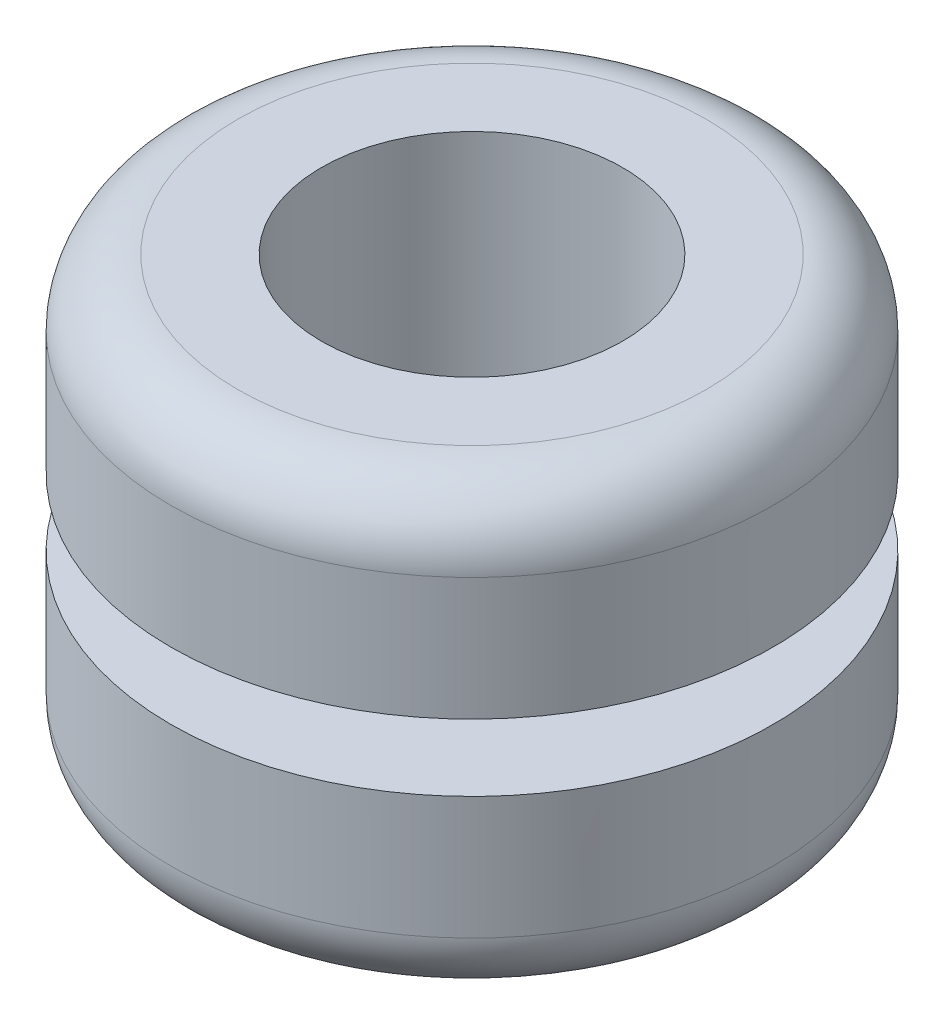
ISO-10303-21;
HEADER;
FILE_DESCRIPTION(('STEP AP214'),'2;1');
FILE_NAME('part.step','',(''),(''),'','','');
FILE_SCHEMA(('AUTOMOTIVE_DESIGN { 1 0 10303 214 1 1 1 1 }'));
ENDSEC;
DATA;
#1=APPLICATION_CONTEXT('core data for automotive mechanical design processes');
#2=APPLICATION_PROTOCOL_DEFINITION('international standard','automotive_design',2000,#1);
#3=PRODUCT_CONTEXT('',#1,'mechanical');
#4=PRODUCT('Part','Part','',(#3));
#5=PRODUCT_RELATED_PRODUCT_CATEGORY('part','',(#4));
#6=PRODUCT_DEFINITION_FORMATION('','',#4);
#7=PRODUCT_DEFINITION_CONTEXT('part definition',#1,'design');
#8=PRODUCT_DEFINITION('design','',#6,#7);
#9=PRODUCT_DEFINITION_SHAPE('','',#8);
#10=(LENGTH_UNIT() NAMED_UNIT(*) SI_UNIT(.MILLI.,.METRE.));
#11=(NAMED_UNIT(*) PLANE_ANGLE_UNIT() SI_UNIT($,.RADIAN.));
#12=(NAMED_UNIT(*) SI_UNIT($,.STERADIAN.) SOLID_ANGLE_UNIT());
#13=UNCERTAINTY_MEASURE_WITH_UNIT(LENGTH_MEASURE(1.E-05),#10,'distance_accuracy_value','');
#14=(GEOMETRIC_REPRESENTATION_CONTEXT(3) GLOBAL_UNCERTAINTY_ASSIGNED_CONTEXT((#13)) GLOBAL_UNIT_ASSIGNED_CONTEXT((#10,
#11,#12)) REPRESENTATION_CONTEXT('',''));
#15=CARTESIAN_POINT('',(0.,0.,0.));
#16=DIRECTION('',(0.,0.,1.));
#17=DIRECTION('',(1.,0.,0.));
#18=AXIS2_PLACEMENT_3D('',#15,#16,#17);
#19=CARTESIAN_POINT('',(0.,0.,0.));
#20=DIRECTION('',(0.,1.,0.));
#21=DIRECTION('',(0.,0.,1.));
#22=AXIS2_PLACEMENT_3D('',#19,#20,#21);
#23=CYLINDRICAL_SURFACE('',#22,4.064);
#24=CARTESIAN_POINT('',(0.,5.842,0.));
#25=DIRECTION('',(0.,1.,0.));
#26=DIRECTION('',(0.,0.,1.));
#27=AXIS2_PLACEMENT_3D('',#24,#25,#26);
#28=CIRCLE('',#27,4.064);
#29=CARTESIAN_POINT('',(0.,5.842,4.064));
#30=VERTEX_POINT('',#29);
#31=EDGE_CURVE('E172',#30,#30,#28,.F.);
#32=ORIENTED_EDGE('',*,*,#31,.T.);
#33=EDGE_LOOP('',(#32));
#34=FACE_BOUND('',#33,.T.);
#35=CARTESIAN_POINT('',(0.,4.318,0.));
#36=DIRECTION('',(0.,1.,0.));
#37=DIRECTION('',(0.,0.,1.));
#38=AXIS2_PLACEMENT_3D('',#35,#36,#37);
#39=CIRCLE('',#38,4.064);
#40=CARTESIAN_POINT('',(0.,4.318,4.064));
#41=VERTEX_POINT('',#40);
#42=EDGE_CURVE('E169',#41,#41,#39,.T.);
#43=ORIENTED_EDGE('',*,*,#42,.T.);
#44=EDGE_LOOP('',(#43));
#45=FACE_BOUND('',#44,.T.);
#46=ADVANCED_FACE('F16',(#34,#45),#23,.T.);
#47=CARTESIAN_POINT('',(0.,5.842,0.));
#48=DIRECTION('',(0.,1.,0.));
#49=DIRECTION('',(0.,0.,1.));
#50=AXIS2_PLACEMENT_3D('',#47,#48,#49);
#51=PLANE('',#50);
#52=ORIENTED_EDGE('',*,*,#31,.F.);
#53=EDGE_LOOP('',(#52));
#54=FACE_BOUND('',#53,.T.);
#55=CARTESIAN_POINT('',(0.,5.842,0.));
#56=DIRECTION('',(0.,1.,0.));
#57=DIRECTION('',(0.,0.,1.));
#58=AXIS2_PLACEMENT_3D('',#55,#56,#57);
#59=CIRCLE('',#58,6.858);
#60=CARTESIAN_POINT('',(0.,5.842,6.858));
#61=VERTEX_POINT('',#60);
#62=EDGE_CURVE('E166',#61,#61,#59,.T.);
#63=ORIENTED_EDGE('',*,*,#62,.F.);
#64=EDGE_LOOP('',(#63));
#65=FACE_BOUND('',#64,.T.);
#66=ADVANCED_FACE('F90',(#54,#65),#51,.F.);
#67=CARTESIAN_POINT('',(0.,4.318,0.));
#68=DIRECTION('',(0.,-1.,0.));
#69=DIRECTION('',(0.,0.,-1.));
#70=AXIS2_PLACEMENT_3D('',#67,#68,#69);
#71=PLANE('',#70);
#72=ORIENTED_EDGE('',*,*,#42,.F.);
#73=EDGE_LOOP('',(#72));
#74=FACE_BOUND('',#73,.T.);
#75=CARTESIAN_POINT('',(0.,4.318,0.));
#76=DIRECTION('',(0.,-1.,0.));
#77=DIRECTION('',(0.,0.,-1.));
#78=AXIS2_PLACEMENT_3D('',#75,#76,#77);
#79=CIRCLE('',#78,6.858);
#80=CARTESIAN_POINT('',(0.,4.318,-6.858));
#81=VERTEX_POINT('',#80);
#82=EDGE_CURVE('E162',#81,#81,#79,.T.);
#83=ORIENTED_EDGE('',*,*,#82,.F.);
#84=EDGE_LOOP('',(#83));
#85=FACE_BOUND('',#84,.T.);
#86=ADVANCED_FACE('F87',(#74,#85),#71,.F.);
#87=CARTESIAN_POINT('',(0.,10.16,0.));
#88=DIRECTION('',(0.,1.,0.));
#89=DIRECTION('',(0.,0.,1.));
#90=AXIS2_PLACEMENT_3D('',#87,#88,#89);
#91=CYLINDRICAL_SURFACE('',#90,6.858);
#92=ORIENTED_EDGE('',*,*,#62,.T.);
#93=EDGE_LOOP('',(#92));
#94=FACE_BOUND('',#93,.T.);
#95=CARTESIAN_POINT('',(0.,8.636,0.));
#96=DIRECTION('',(0.,1.,0.));
#97=DIRECTION('',(-0.999987948406019,0.,-0.00490948497510109));
#98=AXIS2_PLACEMENT_3D('',#95,#96,#97);
#99=CIRCLE('',#98,6.858);
#100=CARTESIAN_POINT('',(-6.85791735016848,8.636,-0.0336692479592433));
#101=VERTEX_POINT('',#100);
#102=EDGE_CURVE('E165',#101,#101,#99,.T.);
#103=ORIENTED_EDGE('',*,*,#102,.F.);
#104=EDGE_LOOP('',(#103));
#105=FACE_BOUND('',#104,.T.);
#106=ADVANCED_FACE('F83',(#94,#105),#91,.T.);
#107=CARTESIAN_POINT('',(0.,0.,0.));
#108=DIRECTION('',(0.,-1.,0.));
#109=DIRECTION('',(0.,0.,-1.));
#110=AXIS2_PLACEMENT_3D('',#107,#108,#109);
#111=CYLINDRICAL_SURFACE('',#110,6.858);
#112=ORIENTED_EDGE('',*,*,#82,.T.);
#113=EDGE_LOOP('',(#112));
#114=FACE_BOUND('',#113,.T.);
#115=CARTESIAN_POINT('',(0.,1.524,0.));
#116=DIRECTION('',(0.,-1.,0.));
#117=DIRECTION('',(0.999987948406019,0.,-0.00490948497510109));
#118=AXIS2_PLACEMENT_3D('',#115,#116,#117);
#119=CIRCLE('',#118,6.858);
#120=CARTESIAN_POINT('',(6.85791735016848,1.524,-0.0336692479592433));
#121=VERTEX_POINT('',#120);
#122=EDGE_CURVE('E51',#121,#121,#119,.T.);
#123=ORIENTED_EDGE('',*,*,#122,.F.);
#124=EDGE_LOOP('',(#123));
#125=FACE_BOUND('',#124,.T.);
#126=ADVANCED_FACE('F75',(#114,#125),#111,.T.);
#127=CARTESIAN_POINT('',(0.,8.636,0.));
#128=DIRECTION('',(0.,1.,0.));
#129=DIRECTION('',(-0.999987948406019,0.,-0.0049094849751011));
#130=AXIS2_PLACEMENT_3D('',#127,#128,#129);
#131=TOROIDAL_SURFACE('',#130,5.334,1.524);
#132=ORIENTED_EDGE('',*,*,#102,.T.);
#133=EDGE_LOOP('',(#132));
#134=FACE_BOUND('',#133,.T.);
#135=CARTESIAN_POINT('',(0.,10.16,0.));
#136=DIRECTION('',(0.,-1.,0.));
#137=DIRECTION('',(1.,0.,0.));
#138=AXIS2_PLACEMENT_3D('',#135,#136,#137);
#139=CIRCLE('',#138,5.334);
#140=CARTESIAN_POINT('',(-5.334,10.16,0.));
#141=VERTEX_POINT('',#140);
#142=CARTESIAN_POINT('',(5.334,10.16,0.));
#143=VERTEX_POINT('',#142);
#144=EDGE_CURVE('E44',#141,#143,#139,.F.);
#145=ORIENTED_EDGE('',*,*,#144,.F.);
#146=CARTESIAN_POINT('',(0.,10.16,0.));
#147=DIRECTION('',(0.,-1.,0.));
#148=DIRECTION('',(-1.,0.,0.));
#149=AXIS2_PLACEMENT_3D('',#146,#147,#148);
#150=CIRCLE('',#149,5.334);
#151=EDGE_CURVE('E47',#143,#141,#150,.F.);
#152=ORIENTED_EDGE('',*,*,#151,.F.);
#153=EDGE_LOOP('',(#145,#152));
#154=FACE_BOUND('',#153,.T.);
#155=ADVANCED_FACE('F55',(#134,#154),#131,.T.);
#156=CARTESIAN_POINT('',(0.,1.524,0.));
#157=DIRECTION('',(0.,-1.,0.));
#158=DIRECTION('',(0.999987948406019,0.,-0.0049094849751011));
#159=AXIS2_PLACEMENT_3D('',#156,#157,#158);
#160=TOROIDAL_SURFACE('',#159,5.334,1.524);
#161=ORIENTED_EDGE('',*,*,#122,.T.);
#162=EDGE_LOOP('',(#161));
#163=FACE_BOUND('',#162,.T.);
#164=CARTESIAN_POINT('',(0.,0.,0.));
#165=DIRECTION('',(0.,1.,0.));
#166=DIRECTION('',(-1.,0.,0.));
#167=AXIS2_PLACEMENT_3D('',#164,#165,#166);
#168=CIRCLE('',#167,5.334);
#169=CARTESIAN_POINT('',(-5.334,0.,0.));
#170=VERTEX_POINT('',#169);
#171=CARTESIAN_POINT('',(5.334,0.,0.));
#172=VERTEX_POINT('',#171);
#173=EDGE_CURVE('E35',#170,#172,#168,.T.);
#174=ORIENTED_EDGE('',*,*,#173,.T.);
#175=CARTESIAN_POINT('',(0.,0.,0.));
#176=DIRECTION('',(0.,1.,0.));
#177=DIRECTION('',(1.,0.,0.));
#178=AXIS2_PLACEMENT_3D('',#175,#176,#177);
#179=CIRCLE('',#178,5.334);
#180=EDGE_CURVE('E56',#172,#170,#179,.T.);
#181=ORIENTED_EDGE('',*,*,#180,.T.);
#182=EDGE_LOOP('',(#174,#181));
#183=FACE_BOUND('',#182,.T.);
#184=ADVANCED_FACE('F74',(#163,#183),#160,.T.);
#185=CARTESIAN_POINT('',(0.,10.16,0.));
#186=DIRECTION('',(0.,1.,0.));
#187=DIRECTION('',(0.,0.,1.));
#188=AXIS2_PLACEMENT_3D('',#185,#186,#187);
#189=PLANE('',#188);
#190=CARTESIAN_POINT('',(0.,10.16,0.));
#191=DIRECTION('',(0.,1.,0.));
#192=DIRECTION('',(0.,0.,1.));
#193=AXIS2_PLACEMENT_3D('',#190,#191,#192);
#194=CIRCLE('',#193,3.429);
#195=CARTESIAN_POINT('',(0.,10.16,3.429));
#196=VERTEX_POINT('',#195);
#197=EDGE_CURVE('E27',#196,#196,#194,.F.);
#198=ORIENTED_EDGE('',*,*,#197,.T.);
#199=EDGE_LOOP('',(#198));
#200=FACE_BOUND('',#199,.T.);
#201=ORIENTED_EDGE('',*,*,#151,.T.);
#202=ORIENTED_EDGE('',*,*,#144,.T.);
#203=EDGE_LOOP('',(#201,#202));
#204=FACE_BOUND('',#203,.T.);
#205=ADVANCED_FACE('F49',(#200,#204),#189,.T.);
#206=CARTESIAN_POINT('',(0.,0.,0.));
#207=DIRECTION('',(0.,1.,0.));
#208=DIRECTION('',(0.,0.,1.));
#209=AXIS2_PLACEMENT_3D('',#206,#207,#208);
#210=PLANE('',#209);
#211=CARTESIAN_POINT('',(0.,0.,0.));
#212=DIRECTION('',(0.,1.,0.));
#213=DIRECTION('',(0.,0.,1.));
#214=AXIS2_PLACEMENT_3D('',#211,#212,#213);
#215=CIRCLE('',#214,3.429);
#216=CARTESIAN_POINT('',(0.,0.,3.429));
#217=VERTEX_POINT('',#216);
#218=EDGE_CURVE('E11',#217,#217,#215,.T.);
#219=ORIENTED_EDGE('',*,*,#218,.T.);
#220=EDGE_LOOP('',(#219));
#221=FACE_BOUND('',#220,.T.);
#222=ORIENTED_EDGE('',*,*,#180,.F.);
#223=ORIENTED_EDGE('',*,*,#173,.F.);
#224=EDGE_LOOP('',(#222,#223));
#225=FACE_BOUND('',#224,.T.);
#226=ADVANCED_FACE('F103',(#221,#225),#210,.F.);
#227=CARTESIAN_POINT('',(0.,0.,0.));
#228=DIRECTION('',(0.,1.,0.));
#229=DIRECTION('',(0.,0.,1.));
#230=AXIS2_PLACEMENT_3D('',#227,#228,#229);
#231=CYLINDRICAL_SURFACE('',#230,3.429);
#232=ORIENTED_EDGE('',*,*,#197,.F.);
#233=EDGE_LOOP('',(#232));
#234=FACE_BOUND('',#233,.T.);
#235=ORIENTED_EDGE('',*,*,#218,.F.);
#236=EDGE_LOOP('',(#235));
#237=FACE_BOUND('',#236,.T.);
#238=ADVANCED_FACE('F101',(#234,#237),#231,.F.);
#239=CLOSED_SHELL('',(#46,#66,#86,#106,#126,#155,#184,#205,#226,#238));
#240=MANIFOLD_SOLID_BREP('B1',#239);
#241=ADVANCED_BREP_SHAPE_REPRESENTATION('',(#18,#240),#14);
#242=SHAPE_DEFINITION_REPRESENTATION(#9,#241);
ENDSEC;
END-ISO-10303-21;
